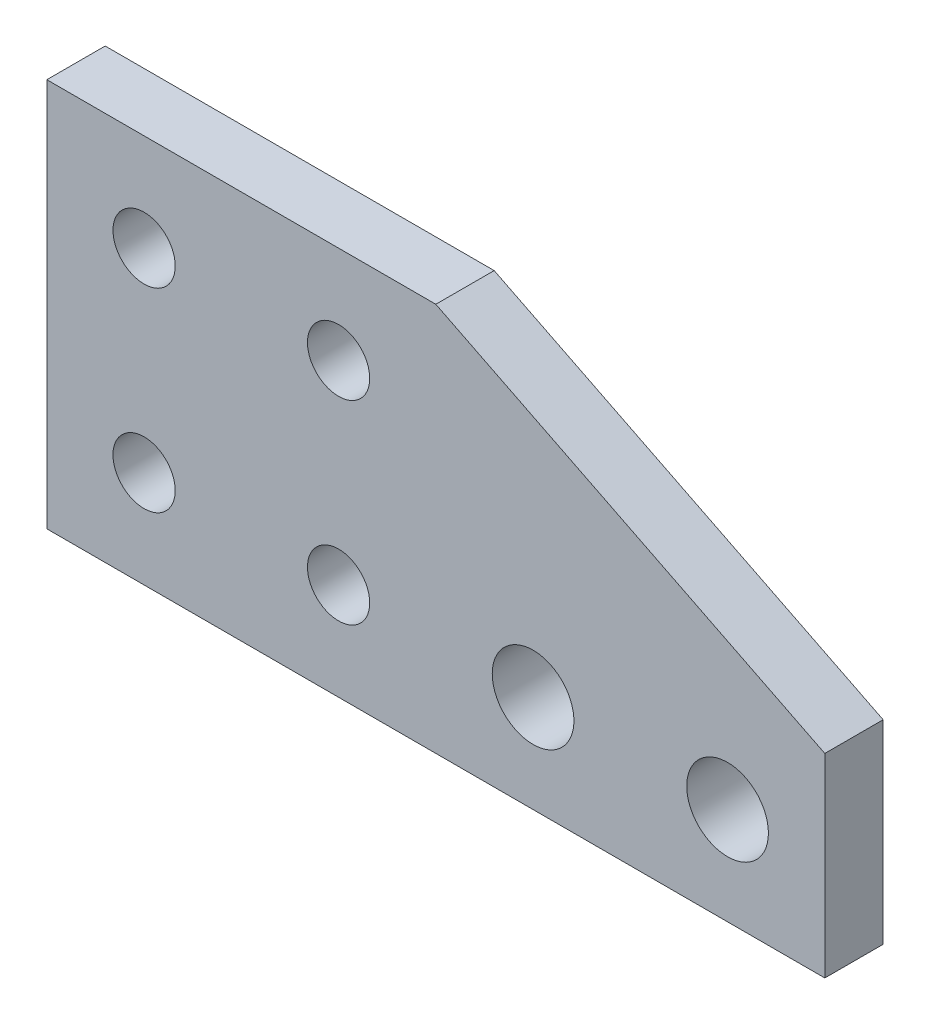
ISO-10303-21;
HEADER;
FILE_DESCRIPTION(('STEP AP214'),'2;1');
FILE_NAME('part.step','',(''),(''),'','','');
FILE_SCHEMA(('AUTOMOTIVE_DESIGN { 1 0 10303 214 1 1 1 1 }'));
ENDSEC;
DATA;
#1=APPLICATION_CONTEXT('core data for automotive mechanical design processes');
#2=APPLICATION_PROTOCOL_DEFINITION('international standard','automotive_design',2000,#1);
#3=PRODUCT_CONTEXT('',#1,'mechanical');
#4=PRODUCT('Part','Part','',(#3));
#5=PRODUCT_RELATED_PRODUCT_CATEGORY('part','',(#4));
#6=PRODUCT_DEFINITION_FORMATION('','',#4);
#7=PRODUCT_DEFINITION_CONTEXT('part definition',#1,'design');
#8=PRODUCT_DEFINITION('design','',#6,#7);
#9=PRODUCT_DEFINITION_SHAPE('','',#8);
#10=(LENGTH_UNIT() NAMED_UNIT(*) SI_UNIT(.MILLI.,.METRE.));
#11=(NAMED_UNIT(*) PLANE_ANGLE_UNIT() SI_UNIT($,.RADIAN.));
#12=(NAMED_UNIT(*) SI_UNIT($,.STERADIAN.) SOLID_ANGLE_UNIT());
#13=UNCERTAINTY_MEASURE_WITH_UNIT(LENGTH_MEASURE(1.E-05),#10,'distance_accuracy_value','');
#14=(GEOMETRIC_REPRESENTATION_CONTEXT(3) GLOBAL_UNCERTAINTY_ASSIGNED_CONTEXT((#13)) GLOBAL_UNIT_ASSIGNED_CONTEXT((#10,
#11,#12)) REPRESENTATION_CONTEXT('',''));
#15=CARTESIAN_POINT('',(0.,0.,0.));
#16=DIRECTION('',(0.,0.,1.));
#17=DIRECTION('',(1.,0.,0.));
#18=AXIS2_PLACEMENT_3D('',#15,#16,#17);
#19=CARTESIAN_POINT('',(0.,-20.,3.));
#20=DIRECTION('',(1.,0.,0.));
#21=DIRECTION('',(0.,0.,-1.));
#22=AXIS2_PLACEMENT_3D('',#19,#20,#21);
#23=PLANE('',#22);
#24=DIRECTION('',(0.,-1.,0.));
#25=VECTOR('',#24,1.);
#26=CARTESIAN_POINT('',(0.,-20.,0.));
#27=LINE('',#26,#25);
#28=CARTESIAN_POINT('',(0.,0.,0.));
#29=VERTEX_POINT('',#28);
#30=CARTESIAN_POINT('',(0.,-20.,0.));
#31=VERTEX_POINT('',#30);
#32=EDGE_CURVE('E118',#29,#31,#27,.T.);
#33=ORIENTED_EDGE('',*,*,#32,.T.);
#34=DIRECTION('',(0.,0.,-1.));
#35=VECTOR('',#34,1.);
#36=CARTESIAN_POINT('',(0.,-20.,3.));
#37=LINE('',#36,#35);
#38=CARTESIAN_POINT('',(0.,-20.,3.));
#39=VERTEX_POINT('',#38);
#40=EDGE_CURVE('E11',#39,#31,#37,.T.);
#41=ORIENTED_EDGE('',*,*,#40,.F.);
#42=DIRECTION('',(0.,-1.,0.));
#43=VECTOR('',#42,1.);
#44=CARTESIAN_POINT('',(0.,-20.,3.));
#45=LINE('',#44,#43);
#46=CARTESIAN_POINT('',(0.,0.,3.));
#47=VERTEX_POINT('',#46);
#48=EDGE_CURVE('E151',#47,#39,#45,.T.);
#49=ORIENTED_EDGE('',*,*,#48,.F.);
#50=DIRECTION('',(0.,0.,-1.));
#51=VECTOR('',#50,1.);
#52=CARTESIAN_POINT('',(0.,0.,3.));
#53=LINE('',#52,#51);
#54=EDGE_CURVE('E155',#47,#29,#53,.T.);
#55=ORIENTED_EDGE('',*,*,#54,.T.);
#56=EDGE_LOOP('',(#33,#41,#49,#55));
#57=FACE_BOUND('',#56,.T.);
#58=ADVANCED_FACE('F41',(#57),#23,.F.);
#59=CARTESIAN_POINT('',(40.,-20.,3.));
#60=DIRECTION('',(0.,1.,0.));
#61=DIRECTION('',(-1.,0.,0.));
#62=AXIS2_PLACEMENT_3D('',#59,#60,#61);
#63=PLANE('',#62);
#64=DIRECTION('',(1.,0.,0.));
#65=VECTOR('',#64,1.);
#66=CARTESIAN_POINT('',(40.,-20.,0.));
#67=LINE('',#66,#65);
#68=CARTESIAN_POINT('',(40.,-20.,0.));
#69=VERTEX_POINT('',#68);
#70=EDGE_CURVE('E158',#31,#69,#67,.T.);
#71=ORIENTED_EDGE('',*,*,#70,.T.);
#72=DIRECTION('',(0.,0.,-1.));
#73=VECTOR('',#72,1.);
#74=CARTESIAN_POINT('',(40.,-20.,3.));
#75=LINE('',#74,#73);
#76=CARTESIAN_POINT('',(40.,-20.,3.));
#77=VERTEX_POINT('',#76);
#78=EDGE_CURVE('E49',#77,#69,#75,.T.);
#79=ORIENTED_EDGE('',*,*,#78,.F.);
#80=DIRECTION('',(1.,0.,0.));
#81=VECTOR('',#80,1.);
#82=CARTESIAN_POINT('',(40.,-20.,3.));
#83=LINE('',#82,#81);
#84=EDGE_CURVE('E87',#39,#77,#83,.T.);
#85=ORIENTED_EDGE('',*,*,#84,.F.);
#86=ORIENTED_EDGE('',*,*,#40,.T.);
#87=EDGE_LOOP('',(#71,#79,#85,#86));
#88=FACE_BOUND('',#87,.T.);
#89=ADVANCED_FACE('F178',(#88),#63,.F.);
#90=CARTESIAN_POINT('',(40.,-10.,3.));
#91=DIRECTION('',(-1.,0.,0.));
#92=DIRECTION('',(0.,-1.,0.));
#93=AXIS2_PLACEMENT_3D('',#90,#91,#92);
#94=PLANE('',#93);
#95=DIRECTION('',(0.,1.,0.));
#96=VECTOR('',#95,1.);
#97=CARTESIAN_POINT('',(40.,-10.,0.));
#98=LINE('',#97,#96);
#99=CARTESIAN_POINT('',(40.,-10.,0.));
#100=VERTEX_POINT('',#99);
#101=EDGE_CURVE('E104',#69,#100,#98,.T.);
#102=ORIENTED_EDGE('',*,*,#101,.T.);
#103=DIRECTION('',(0.,0.,-1.));
#104=VECTOR('',#103,1.);
#105=CARTESIAN_POINT('',(40.,-10.,3.));
#106=LINE('',#105,#104);
#107=CARTESIAN_POINT('',(40.,-10.,3.));
#108=VERTEX_POINT('',#107);
#109=EDGE_CURVE('E101',#108,#100,#106,.T.);
#110=ORIENTED_EDGE('',*,*,#109,.F.);
#111=DIRECTION('',(0.,1.,0.));
#112=VECTOR('',#111,1.);
#113=CARTESIAN_POINT('',(40.,-10.,3.));
#114=LINE('',#113,#112);
#115=EDGE_CURVE('E91',#77,#108,#114,.T.);
#116=ORIENTED_EDGE('',*,*,#115,.F.);
#117=ORIENTED_EDGE('',*,*,#78,.T.);
#118=EDGE_LOOP('',(#102,#110,#116,#117));
#119=FACE_BOUND('',#118,.T.);
#120=ADVANCED_FACE('F102',(#119),#94,.F.);
#121=CARTESIAN_POINT('',(0.,0.,3.));
#122=DIRECTION('',(0.,-1.,0.));
#123=DIRECTION('',(0.,0.,-1.));
#124=AXIS2_PLACEMENT_3D('',#121,#122,#123);
#125=PLANE('',#124);
#126=DIRECTION('',(-1.,0.,0.));
#127=VECTOR('',#126,1.);
#128=CARTESIAN_POINT('',(0.,0.,0.));
#129=LINE('',#128,#127);
#130=CARTESIAN_POINT('',(20.,0.,0.));
#131=VERTEX_POINT('',#130);
#132=EDGE_CURVE('E79',#131,#29,#129,.T.);
#133=ORIENTED_EDGE('',*,*,#132,.T.);
#134=ORIENTED_EDGE('',*,*,#54,.F.);
#135=DIRECTION('',(-1.,0.,0.));
#136=VECTOR('',#135,1.);
#137=CARTESIAN_POINT('',(0.,0.,3.));
#138=LINE('',#137,#136);
#139=CARTESIAN_POINT('',(20.,0.,3.));
#140=VERTEX_POINT('',#139);
#141=EDGE_CURVE('E57',#140,#47,#138,.T.);
#142=ORIENTED_EDGE('',*,*,#141,.F.);
#143=DIRECTION('',(0.,0.,-1.));
#144=VECTOR('',#143,1.);
#145=CARTESIAN_POINT('',(20.,0.,3.));
#146=LINE('',#145,#144);
#147=EDGE_CURVE('E76',#140,#131,#146,.T.);
#148=ORIENTED_EDGE('',*,*,#147,.T.);
#149=EDGE_LOOP('',(#133,#134,#142,#148));
#150=FACE_BOUND('',#149,.T.);
#151=ADVANCED_FACE('F170',(#150),#125,.F.);
#152=CARTESIAN_POINT('',(0.,0.,3.));
#153=DIRECTION('',(0.,0.,-1.));
#154=DIRECTION('',(-1.,0.,0.));
#155=AXIS2_PLACEMENT_3D('',#152,#153,#154);
#156=PLANE('',#155);
#157=DIRECTION('',(-0.894427190999916,0.447213595499958,0.));
#158=VECTOR('',#157,1.);
#159=CARTESIAN_POINT('',(20.,0.,3.));
#160=LINE('',#159,#158);
#161=EDGE_CURVE('E96',#108,#140,#160,.T.);
#162=ORIENTED_EDGE('',*,*,#161,.T.);
#163=ORIENTED_EDGE('',*,*,#141,.T.);
#164=ORIENTED_EDGE('',*,*,#48,.T.);
#165=ORIENTED_EDGE('',*,*,#84,.T.);
#166=ORIENTED_EDGE('',*,*,#115,.T.);
#167=EDGE_LOOP('',(#162,#163,#164,#165,#166));
#168=FACE_BOUND('',#167,.T.);
#169=CARTESIAN_POINT('',(35.,-15.,3.));
#170=DIRECTION('',(0.,0.,1.));
#171=DIRECTION('',(1.,0.,0.));
#172=AXIS2_PLACEMENT_3D('',#169,#170,#171);
#173=CIRCLE('',#172,2.1);
#174=CARTESIAN_POINT('',(37.1,-15.,3.));
#175=VERTEX_POINT('',#174);
#176=EDGE_CURVE('E119',#175,#175,#173,.T.);
#177=ORIENTED_EDGE('',*,*,#176,.F.);
#178=EDGE_LOOP('',(#177));
#179=FACE_BOUND('',#178,.T.);
#180=CARTESIAN_POINT('',(15.,-15.,3.));
#181=DIRECTION('',(0.,0.,1.));
#182=DIRECTION('',(1.,0.,0.));
#183=AXIS2_PLACEMENT_3D('',#180,#181,#182);
#184=CIRCLE('',#183,1.6);
#185=CARTESIAN_POINT('',(16.6,-15.,3.));
#186=VERTEX_POINT('',#185);
#187=EDGE_CURVE('E123',#186,#186,#184,.T.);
#188=ORIENTED_EDGE('',*,*,#187,.F.);
#189=EDGE_LOOP('',(#188));
#190=FACE_BOUND('',#189,.T.);
#191=CARTESIAN_POINT('',(25.,-15.,3.));
#192=DIRECTION('',(0.,0.,1.));
#193=DIRECTION('',(-1.,0.,0.));
#194=AXIS2_PLACEMENT_3D('',#191,#192,#193);
#195=CIRCLE('',#194,2.1);
#196=CARTESIAN_POINT('',(22.9,-15.,3.));
#197=VERTEX_POINT('',#196);
#198=EDGE_CURVE('E122',#197,#197,#195,.T.);
#199=ORIENTED_EDGE('',*,*,#198,.F.);
#200=EDGE_LOOP('',(#199));
#201=FACE_BOUND('',#200,.T.);
#202=CARTESIAN_POINT('',(5.,-5.,3.));
#203=DIRECTION('',(0.,0.,1.));
#204=DIRECTION('',(1.,0.,0.));
#205=AXIS2_PLACEMENT_3D('',#202,#203,#204);
#206=CIRCLE('',#205,1.6);
#207=CARTESIAN_POINT('',(6.6,-5.,3.));
#208=VERTEX_POINT('',#207);
#209=EDGE_CURVE('E146',#208,#208,#206,.T.);
#210=ORIENTED_EDGE('',*,*,#209,.F.);
#211=EDGE_LOOP('',(#210));
#212=FACE_BOUND('',#211,.T.);
#213=CARTESIAN_POINT('',(5.,-15.,3.));
#214=DIRECTION('',(0.,0.,1.));
#215=DIRECTION('',(-1.,0.,0.));
#216=AXIS2_PLACEMENT_3D('',#213,#214,#215);
#217=CIRCLE('',#216,1.6);
#218=CARTESIAN_POINT('',(3.4,-15.,3.));
#219=VERTEX_POINT('',#218);
#220=EDGE_CURVE('E129',#219,#219,#217,.T.);
#221=ORIENTED_EDGE('',*,*,#220,.F.);
#222=EDGE_LOOP('',(#221));
#223=FACE_BOUND('',#222,.T.);
#224=CARTESIAN_POINT('',(15.,-5.,3.));
#225=DIRECTION('',(0.,0.,1.));
#226=DIRECTION('',(-1.,0.,0.));
#227=AXIS2_PLACEMENT_3D('',#224,#225,#226);
#228=CIRCLE('',#227,1.6);
#229=CARTESIAN_POINT('',(13.4,-5.,3.));
#230=VERTEX_POINT('',#229);
#231=EDGE_CURVE('E136',#230,#230,#228,.T.);
#232=ORIENTED_EDGE('',*,*,#231,.F.);
#233=EDGE_LOOP('',(#232));
#234=FACE_BOUND('',#233,.T.);
#235=ADVANCED_FACE('F93',(#168,#179,#190,#201,#212,#223,#234),#156,.F.);
#236=CARTESIAN_POINT('',(0.,0.,0.));
#237=DIRECTION('',(0.,0.,-1.));
#238=DIRECTION('',(-1.,0.,0.));
#239=AXIS2_PLACEMENT_3D('',#236,#237,#238);
#240=PLANE('',#239);
#241=ORIENTED_EDGE('',*,*,#132,.F.);
#242=DIRECTION('',(-0.894427190999916,0.447213595499958,0.));
#243=VECTOR('',#242,1.);
#244=CARTESIAN_POINT('',(20.,0.,0.));
#245=LINE('',#244,#243);
#246=EDGE_CURVE('E110',#100,#131,#245,.T.);
#247=ORIENTED_EDGE('',*,*,#246,.F.);
#248=ORIENTED_EDGE('',*,*,#101,.F.);
#249=ORIENTED_EDGE('',*,*,#70,.F.);
#250=ORIENTED_EDGE('',*,*,#32,.F.);
#251=EDGE_LOOP('',(#241,#247,#248,#249,#250));
#252=FACE_BOUND('',#251,.T.);
#253=CARTESIAN_POINT('',(35.,-15.,0.));
#254=DIRECTION('',(0.,0.,1.));
#255=DIRECTION('',(1.,0.,0.));
#256=AXIS2_PLACEMENT_3D('',#253,#254,#255);
#257=CIRCLE('',#256,2.1);
#258=CARTESIAN_POINT('',(37.1,-15.,0.));
#259=VERTEX_POINT('',#258);
#260=EDGE_CURVE('E115',#259,#259,#257,.T.);
#261=ORIENTED_EDGE('',*,*,#260,.T.);
#262=EDGE_LOOP('',(#261));
#263=FACE_BOUND('',#262,.T.);
#264=CARTESIAN_POINT('',(15.,-15.,0.));
#265=DIRECTION('',(0.,0.,1.));
#266=DIRECTION('',(1.,0.,0.));
#267=AXIS2_PLACEMENT_3D('',#264,#265,#266);
#268=CIRCLE('',#267,1.6);
#269=CARTESIAN_POINT('',(16.6,-15.,0.));
#270=VERTEX_POINT('',#269);
#271=EDGE_CURVE('E112',#270,#270,#268,.T.);
#272=ORIENTED_EDGE('',*,*,#271,.T.);
#273=EDGE_LOOP('',(#272));
#274=FACE_BOUND('',#273,.T.);
#275=CARTESIAN_POINT('',(25.,-15.,0.));
#276=DIRECTION('',(0.,0.,1.));
#277=DIRECTION('',(-1.,0.,0.));
#278=AXIS2_PLACEMENT_3D('',#275,#276,#277);
#279=CIRCLE('',#278,2.1);
#280=CARTESIAN_POINT('',(22.9,-15.,0.));
#281=VERTEX_POINT('',#280);
#282=EDGE_CURVE('E143',#281,#281,#279,.T.);
#283=ORIENTED_EDGE('',*,*,#282,.T.);
#284=EDGE_LOOP('',(#283));
#285=FACE_BOUND('',#284,.T.);
#286=CARTESIAN_POINT('',(5.,-5.,0.));
#287=DIRECTION('',(0.,0.,1.));
#288=DIRECTION('',(1.,0.,0.));
#289=AXIS2_PLACEMENT_3D('',#286,#287,#288);
#290=CIRCLE('',#289,1.6);
#291=CARTESIAN_POINT('',(6.6,-5.,0.));
#292=VERTEX_POINT('',#291);
#293=EDGE_CURVE('E132',#292,#292,#290,.T.);
#294=ORIENTED_EDGE('',*,*,#293,.T.);
#295=EDGE_LOOP('',(#294));
#296=FACE_BOUND('',#295,.T.);
#297=CARTESIAN_POINT('',(5.,-15.,0.));
#298=DIRECTION('',(0.,0.,1.));
#299=DIRECTION('',(-1.,0.,0.));
#300=AXIS2_PLACEMENT_3D('',#297,#298,#299);
#301=CIRCLE('',#300,1.6);
#302=CARTESIAN_POINT('',(3.4,-15.,0.));
#303=VERTEX_POINT('',#302);
#304=EDGE_CURVE('E133',#303,#303,#301,.T.);
#305=ORIENTED_EDGE('',*,*,#304,.T.);
#306=EDGE_LOOP('',(#305));
#307=FACE_BOUND('',#306,.T.);
#308=CARTESIAN_POINT('',(15.,-5.,0.));
#309=DIRECTION('',(0.,0.,1.));
#310=DIRECTION('',(-1.,0.,0.));
#311=AXIS2_PLACEMENT_3D('',#308,#309,#310);
#312=CIRCLE('',#311,1.6);
#313=CARTESIAN_POINT('',(13.4,-5.,0.));
#314=VERTEX_POINT('',#313);
#315=EDGE_CURVE('E126',#314,#314,#312,.T.);
#316=ORIENTED_EDGE('',*,*,#315,.T.);
#317=EDGE_LOOP('',(#316));
#318=FACE_BOUND('',#317,.T.);
#319=ADVANCED_FACE('F164',(#252,#263,#274,#285,#296,#307,#318),#240,.T.);
#320=CARTESIAN_POINT('',(15.,-5.,0.));
#321=DIRECTION('',(0.,0.,1.));
#322=DIRECTION('',(1.,0.,0.));
#323=AXIS2_PLACEMENT_3D('',#320,#321,#322);
#324=CYLINDRICAL_SURFACE('',#323,1.6);
#325=ORIENTED_EDGE('',*,*,#315,.F.);
#326=EDGE_LOOP('',(#325));
#327=FACE_BOUND('',#326,.T.);
#328=ORIENTED_EDGE('',*,*,#231,.T.);
#329=EDGE_LOOP('',(#328));
#330=FACE_BOUND('',#329,.T.);
#331=ADVANCED_FACE('F192',(#327,#330),#324,.F.);
#332=CARTESIAN_POINT('',(5.,-15.,0.));
#333=DIRECTION('',(0.,0.,1.));
#334=DIRECTION('',(1.,0.,0.));
#335=AXIS2_PLACEMENT_3D('',#332,#333,#334);
#336=CYLINDRICAL_SURFACE('',#335,1.6);
#337=ORIENTED_EDGE('',*,*,#304,.F.);
#338=EDGE_LOOP('',(#337));
#339=FACE_BOUND('',#338,.T.);
#340=ORIENTED_EDGE('',*,*,#220,.T.);
#341=EDGE_LOOP('',(#340));
#342=FACE_BOUND('',#341,.T.);
#343=ADVANCED_FACE('F196',(#339,#342),#336,.F.);
#344=CARTESIAN_POINT('',(5.,-5.,0.));
#345=DIRECTION('',(0.,0.,1.));
#346=DIRECTION('',(1.,0.,0.));
#347=AXIS2_PLACEMENT_3D('',#344,#345,#346);
#348=CYLINDRICAL_SURFACE('',#347,1.6);
#349=ORIENTED_EDGE('',*,*,#293,.F.);
#350=EDGE_LOOP('',(#349));
#351=FACE_BOUND('',#350,.T.);
#352=ORIENTED_EDGE('',*,*,#209,.T.);
#353=EDGE_LOOP('',(#352));
#354=FACE_BOUND('',#353,.T.);
#355=ADVANCED_FACE('F206',(#351,#354),#348,.F.);
#356=CARTESIAN_POINT('',(25.,-15.,0.));
#357=DIRECTION('',(0.,0.,1.));
#358=DIRECTION('',(1.,0.,0.));
#359=AXIS2_PLACEMENT_3D('',#356,#357,#358);
#360=CYLINDRICAL_SURFACE('',#359,2.1);
#361=ORIENTED_EDGE('',*,*,#282,.F.);
#362=EDGE_LOOP('',(#361));
#363=FACE_BOUND('',#362,.T.);
#364=ORIENTED_EDGE('',*,*,#198,.T.);
#365=EDGE_LOOP('',(#364));
#366=FACE_BOUND('',#365,.T.);
#367=ADVANCED_FACE('F215',(#363,#366),#360,.F.);
#368=CARTESIAN_POINT('',(15.,-15.,0.));
#369=DIRECTION('',(0.,0.,1.));
#370=DIRECTION('',(1.,0.,0.));
#371=AXIS2_PLACEMENT_3D('',#368,#369,#370);
#372=CYLINDRICAL_SURFACE('',#371,1.6);
#373=ORIENTED_EDGE('',*,*,#271,.F.);
#374=EDGE_LOOP('',(#373));
#375=FACE_BOUND('',#374,.T.);
#376=ORIENTED_EDGE('',*,*,#187,.T.);
#377=EDGE_LOOP('',(#376));
#378=FACE_BOUND('',#377,.T.);
#379=ADVANCED_FACE('F224',(#375,#378),#372,.F.);
#380=CARTESIAN_POINT('',(35.,-15.,0.));
#381=DIRECTION('',(0.,0.,1.));
#382=DIRECTION('',(1.,0.,0.));
#383=AXIS2_PLACEMENT_3D('',#380,#381,#382);
#384=CYLINDRICAL_SURFACE('',#383,2.1);
#385=ORIENTED_EDGE('',*,*,#260,.F.);
#386=EDGE_LOOP('',(#385));
#387=FACE_BOUND('',#386,.T.);
#388=ORIENTED_EDGE('',*,*,#176,.T.);
#389=EDGE_LOOP('',(#388));
#390=FACE_BOUND('',#389,.T.);
#391=ADVANCED_FACE('F233',(#387,#390),#384,.F.);
#392=CARTESIAN_POINT('',(20.,0.,0.));
#393=DIRECTION('',(0.447213595499958,0.894427190999916,0.));
#394=DIRECTION('',(-0.894427190999916,0.447213595499958,0.));
#395=AXIS2_PLACEMENT_3D('',#392,#393,#394);
#396=PLANE('',#395);
#397=ORIENTED_EDGE('',*,*,#161,.F.);
#398=ORIENTED_EDGE('',*,*,#109,.T.);
#399=ORIENTED_EDGE('',*,*,#246,.T.);
#400=ORIENTED_EDGE('',*,*,#147,.F.);
#401=EDGE_LOOP('',(#397,#398,#399,#400));
#402=FACE_BOUND('',#401,.T.);
#403=ADVANCED_FACE('F109',(#402),#396,.T.);
#404=CLOSED_SHELL('',(#58,#89,#120,#151,#235,#319,#331,#343,#355,#367,#379,#391,#403));
#405=MANIFOLD_SOLID_BREP('B2',#404);
#406=ADVANCED_BREP_SHAPE_REPRESENTATION('',(#18,#405),#14);
#407=SHAPE_DEFINITION_REPRESENTATION(#9,#406);
ENDSEC;
END-ISO-10303-21;
